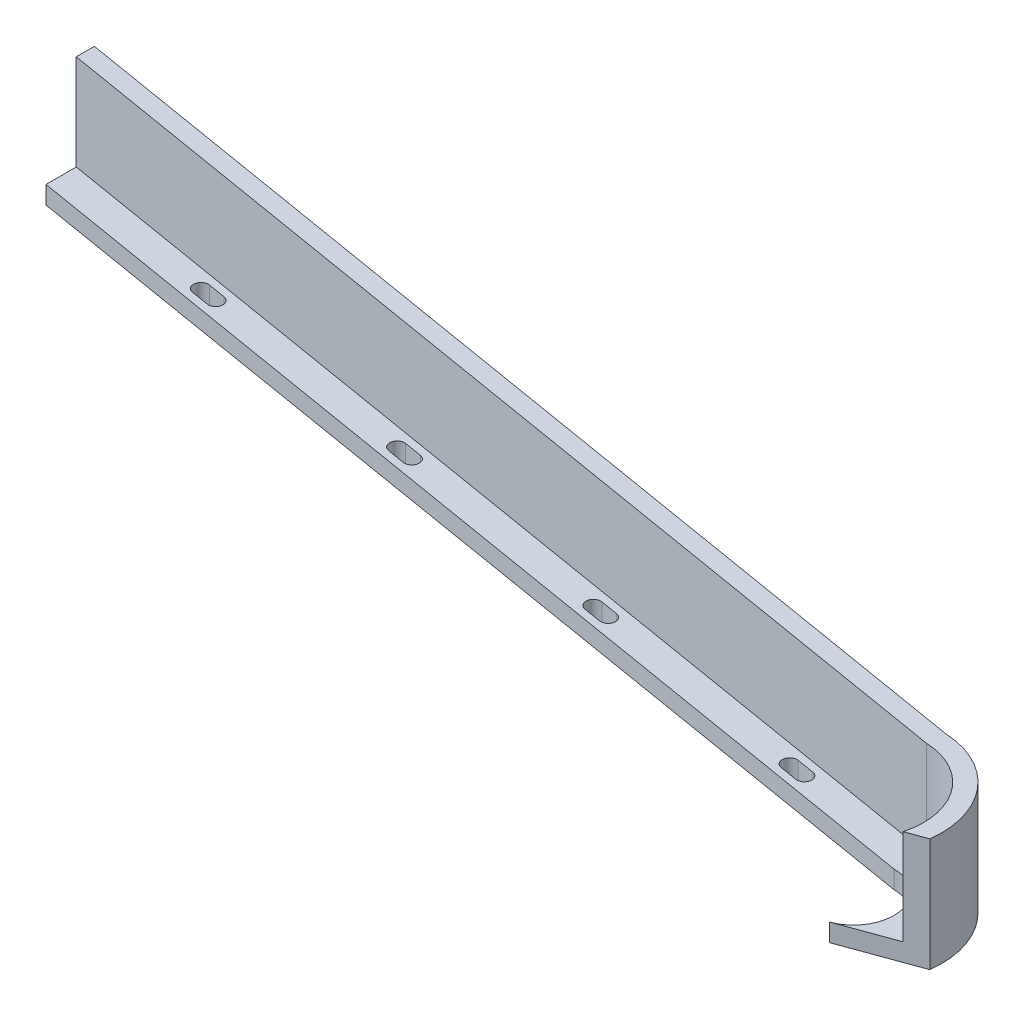
ISO-10303-21;
HEADER;
FILE_DESCRIPTION(('STEP AP214'),'2;1');
FILE_NAME('part.step','',(''),(''),'','','');
FILE_SCHEMA(('AUTOMOTIVE_DESIGN { 1 0 10303 214 1 1 1 1 }'));
ENDSEC;
DATA;
#1=APPLICATION_CONTEXT('core data for automotive mechanical design processes');
#2=APPLICATION_PROTOCOL_DEFINITION('international standard','automotive_design',2000,#1);
#3=PRODUCT_CONTEXT('',#1,'mechanical');
#4=PRODUCT('Part','Part','',(#3));
#5=PRODUCT_RELATED_PRODUCT_CATEGORY('part','',(#4));
#6=PRODUCT_DEFINITION_FORMATION('','',#4);
#7=PRODUCT_DEFINITION_CONTEXT('part definition',#1,'design');
#8=PRODUCT_DEFINITION('design','',#6,#7);
#9=PRODUCT_DEFINITION_SHAPE('','',#8);
#10=(LENGTH_UNIT() NAMED_UNIT(*) SI_UNIT(.MILLI.,.METRE.));
#11=(NAMED_UNIT(*) PLANE_ANGLE_UNIT() SI_UNIT($,.RADIAN.));
#12=(NAMED_UNIT(*) SI_UNIT($,.STERADIAN.) SOLID_ANGLE_UNIT());
#13=UNCERTAINTY_MEASURE_WITH_UNIT(LENGTH_MEASURE(1.E-05),#10,'distance_accuracy_value','');
#14=(GEOMETRIC_REPRESENTATION_CONTEXT(3) GLOBAL_UNCERTAINTY_ASSIGNED_CONTEXT((#13)) GLOBAL_UNIT_ASSIGNED_CONTEXT((#10,
#11,#12)) REPRESENTATION_CONTEXT('',''));
#15=CARTESIAN_POINT('',(0.,0.,0.));
#16=DIRECTION('',(0.,0.,1.));
#17=DIRECTION('',(1.,0.,0.));
#18=AXIS2_PLACEMENT_3D('',#15,#16,#17);
#19=CARTESIAN_POINT('',(121.75,4.,-9.));
#20=DIRECTION('',(0.,1.,0.));
#21=DIRECTION('',(0.,0.,1.));
#22=AXIS2_PLACEMENT_3D('',#19,#20,#21);
#23=PLANE('',#22);
#24=DIRECTION('',(0.986481724359257,0.,0.1638713138569));
#25=VECTOR('',#24,1.);
#26=CARTESIAN_POINT('',(9.56956828655996,4.,-54.0890718197228));
#27=LINE('',#26,#25);
#28=CARTESIAN_POINT('',(9.56956828655996,4.,-54.0890718197228));
#29=VERTEX_POINT('',#28);
#30=CARTESIAN_POINT('',(12.5290134596377,4.,-53.5974578781521));
#31=VERTEX_POINT('',#30);
#32=EDGE_CURVE('E476',#29,#31,#27,.T.);
#33=ORIENTED_EDGE('',*,*,#32,.F.);
#34=CARTESIAN_POINT('',(9.36472914423883,4.,-52.8559696642737));
#35=DIRECTION('',(0.,-1.,0.));
#36=DIRECTION('',(0.,0.,-1.));
#37=AXIS2_PLACEMENT_3D('',#34,#35,#36);
#38=CIRCLE('',#37,1.25000000000001);
#39=CARTESIAN_POINT('',(9.15989000191771,4.,-51.6228675088246));
#40=VERTEX_POINT('',#39);
#41=EDGE_CURVE('E66',#40,#29,#38,.T.);
#42=ORIENTED_EDGE('',*,*,#41,.F.);
#43=DIRECTION('',(0.986481724359257,0.,0.163871313856899));
#44=VECTOR('',#43,1.);
#45=CARTESIAN_POINT('',(9.15989000191771,4.,-51.6228675088246));
#46=LINE('',#45,#44);
#47=CARTESIAN_POINT('',(12.1193351749955,4.,-51.1312535672539));
#48=VERTEX_POINT('',#47);
#49=EDGE_CURVE('E350',#40,#48,#46,.T.);
#50=ORIENTED_EDGE('',*,*,#49,.T.);
#51=CARTESIAN_POINT('',(12.3241743173166,4.,-52.364355722703));
#52=DIRECTION('',(0.,-1.,0.));
#53=DIRECTION('',(0.,0.,-1.));
#54=AXIS2_PLACEMENT_3D('',#51,#52,#53);
#55=CIRCLE('',#54,1.25000000000001);
#56=EDGE_CURVE('E336',#31,#48,#55,.T.);
#57=ORIENTED_EDGE('',*,*,#56,.F.);
#58=EDGE_LOOP('',(#33,#42,#50,#57));
#59=FACE_BOUND('',#58,.T.);
#60=DIRECTION('',(0.986481724359257,0.,0.163871313856899));
#61=VECTOR('',#60,1.);
#62=CARTESIAN_POINT('',(49.0288372609302,4.,-47.5342192654469));
#63=LINE('',#62,#61);
#64=CARTESIAN_POINT('',(49.0288372609302,4.,-47.5342192654468));
#65=VERTEX_POINT('',#64);
#66=CARTESIAN_POINT('',(51.988282434008,4.,-47.0426053238762));
#67=VERTEX_POINT('',#66);
#68=EDGE_CURVE('E373',#65,#67,#63,.T.);
#69=ORIENTED_EDGE('',*,*,#68,.F.);
#70=CARTESIAN_POINT('',(48.8239981186091,4.,-46.3011171099977));
#71=DIRECTION('',(0.,-1.,0.));
#72=DIRECTION('',(0.,0.,-1.));
#73=AXIS2_PLACEMENT_3D('',#70,#71,#72);
#74=CIRCLE('',#73,1.25000000000002);
#75=CARTESIAN_POINT('',(48.619158976288,4.,-45.0680149545487));
#76=VERTEX_POINT('',#75);
#77=EDGE_CURVE('E377',#76,#65,#74,.T.);
#78=ORIENTED_EDGE('',*,*,#77,.F.);
#79=DIRECTION('',(0.986481724359257,0.,0.1638713138569));
#80=VECTOR('',#79,1.);
#81=CARTESIAN_POINT('',(48.619158976288,4.,-45.0680149545487));
#82=LINE('',#81,#80);
#83=CARTESIAN_POINT('',(51.5786041493658,4.,-44.576401012978));
#84=VERTEX_POINT('',#83);
#85=EDGE_CURVE('E355',#76,#84,#82,.T.);
#86=ORIENTED_EDGE('',*,*,#85,.T.);
#87=CARTESIAN_POINT('',(51.7834432916869,4.,-45.809503168427));
#88=DIRECTION('',(0.,-1.,0.));
#89=DIRECTION('',(0.,0.,-1.));
#90=AXIS2_PLACEMENT_3D('',#87,#88,#89);
#91=CIRCLE('',#90,1.25000000000002);
#92=EDGE_CURVE('E369',#67,#84,#91,.T.);
#93=ORIENTED_EDGE('',*,*,#92,.F.);
#94=EDGE_LOOP('',(#69,#78,#86,#93));
#95=FACE_BOUND('',#94,.T.);
#96=DIRECTION('',(0.986481724359258,0.,0.163871313856898));
#97=VECTOR('',#96,1.);
#98=CARTESIAN_POINT('',(88.4881062353005,4.,-40.9793667111709));
#99=LINE('',#98,#97);
#100=CARTESIAN_POINT('',(88.4881062353005,4.,-40.9793667111709));
#101=VERTEX_POINT('',#100);
#102=CARTESIAN_POINT('',(91.4475514083783,4.,-40.4877527696002));
#103=VERTEX_POINT('',#102);
#104=EDGE_CURVE('E402',#101,#103,#99,.T.);
#105=ORIENTED_EDGE('',*,*,#104,.F.);
#106=CARTESIAN_POINT('',(88.2832670929794,4.,-39.7462645557218));
#107=DIRECTION('',(0.,-1.,0.));
#108=DIRECTION('',(0.,0.,-1.));
#109=AXIS2_PLACEMENT_3D('',#106,#107,#108);
#110=CIRCLE('',#109,1.25000000000002);
#111=CARTESIAN_POINT('',(88.0784279506583,4.,-38.5131624002727));
#112=VERTEX_POINT('',#111);
#113=EDGE_CURVE('E365',#112,#101,#110,.T.);
#114=ORIENTED_EDGE('',*,*,#113,.F.);
#115=DIRECTION('',(0.986481724359258,0.,0.163871313856898));
#116=VECTOR('',#115,1.);
#117=CARTESIAN_POINT('',(88.0784279506583,4.,-38.5131624002727));
#118=LINE('',#117,#116);
#119=CARTESIAN_POINT('',(91.037873123736,4.,-38.021548458702));
#120=VERTEX_POINT('',#119);
#121=EDGE_CURVE('E384',#112,#120,#118,.T.);
#122=ORIENTED_EDGE('',*,*,#121,.T.);
#123=CARTESIAN_POINT('',(91.2427122660572,4.,-39.2546506141511));
#124=DIRECTION('',(0.,-1.,0.));
#125=DIRECTION('',(0.,0.,-1.));
#126=AXIS2_PLACEMENT_3D('',#123,#124,#125);
#127=CIRCLE('',#126,1.25000000000002);
#128=EDGE_CURVE('E398',#103,#120,#127,.T.);
#129=ORIENTED_EDGE('',*,*,#128,.F.);
#130=EDGE_LOOP('',(#105,#114,#122,#129));
#131=FACE_BOUND('',#130,.T.);
#132=DIRECTION('',(0.986481724359257,0.,0.1638713138569));
#133=VECTOR('',#132,1.);
#134=CARTESIAN_POINT('',(127.947375209671,4.,-34.4245141568949));
#135=LINE('',#134,#133);
#136=CARTESIAN_POINT('',(127.947375209671,4.,-34.4245141568949));
#137=VERTEX_POINT('',#136);
#138=CARTESIAN_POINT('',(130.906820382749,4.,-33.9329002153242));
#139=VERTEX_POINT('',#138);
#140=EDGE_CURVE('E430',#137,#139,#135,.T.);
#141=ORIENTED_EDGE('',*,*,#140,.F.);
#142=CARTESIAN_POINT('',(127.74253606735,4.,-33.1914120014458));
#143=DIRECTION('',(0.,-1.,0.));
#144=DIRECTION('',(0.,0.,-1.));
#145=AXIS2_PLACEMENT_3D('',#142,#143,#144);
#146=CIRCLE('',#145,1.25000000000002);
#147=CARTESIAN_POINT('',(127.537696925029,4.,-31.9583098459967));
#148=VERTEX_POINT('',#147);
#149=EDGE_CURVE('E394',#148,#137,#146,.T.);
#150=ORIENTED_EDGE('',*,*,#149,.F.);
#151=DIRECTION('',(0.986481724359257,0.,0.1638713138569));
#152=VECTOR('',#151,1.);
#153=CARTESIAN_POINT('',(127.537696925029,4.,-31.9583098459967));
#154=LINE('',#153,#152);
#155=CARTESIAN_POINT('',(130.497142098106,4.,-31.466695904426));
#156=VERTEX_POINT('',#155);
#157=EDGE_CURVE('E412',#148,#156,#154,.T.);
#158=ORIENTED_EDGE('',*,*,#157,.T.);
#159=CARTESIAN_POINT('',(130.701981240427,4.,-32.6997980598751));
#160=DIRECTION('',(0.,-1.,0.));
#161=DIRECTION('',(0.,0.,-1.));
#162=AXIS2_PLACEMENT_3D('',#159,#160,#161);
#163=CIRCLE('',#162,1.25000000000002);
#164=EDGE_CURVE('E426',#139,#156,#163,.T.);
#165=ORIENTED_EDGE('',*,*,#164,.F.);
#166=EDGE_LOOP('',(#141,#150,#158,#165));
#167=FACE_BOUND('',#166,.T.);
#168=CARTESIAN_POINT('',(151.75,4.,-19.9191070279861));
#169=DIRECTION('',(0.,-1.,0.));
#170=DIRECTION('',(0.,0.,-1.));
#171=AXIS2_PLACEMENT_3D('',#168,#169,#170);
#172=CIRCLE('',#171,6.75);
#173=CARTESIAN_POINT('',(151.75,4.,-26.6691070279861));
#174=VERTEX_POINT('',#173);
#175=CARTESIAN_POINT('',(154.058635967448,4.,-13.5761818376812));
#176=VERTEX_POINT('',#175);
#177=EDGE_CURVE('E438',#174,#176,#172,.T.);
#178=ORIENTED_EDGE('',*,*,#177,.F.);
#179=DIRECTION('',(0.986481724359257,0.,0.163871313856899));
#180=VECTOR('',#179,1.);
#181=CARTESIAN_POINT('',(8.38628795520735,4.,-50.4842464999735));
#182=LINE('',#181,#180);
#183=CARTESIAN_POINT('',(-18.75,4.,-54.9920433000686));
#184=VERTEX_POINT('',#183);
#185=EDGE_CURVE('E218',#184,#174,#182,.T.);
#186=ORIENTED_EDGE('',*,*,#185,.F.);
#187=DIRECTION('',(0.,0.,-1.));
#188=VECTOR('',#187,1.);
#189=CARTESIAN_POINT('',(-18.75,4.,-9.00000000000003));
#190=LINE('',#189,#188);
#191=CARTESIAN_POINT('',(-18.75,4.,-63.1016714892742));
#192=VERTEX_POINT('',#191);
#193=EDGE_CURVE('E211',#184,#192,#190,.T.);
#194=ORIENTED_EDGE('',*,*,#193,.T.);
#195=DIRECTION('',(0.986481724359257,0.,0.163871313856899));
#196=VECTOR('',#195,1.);
#197=CARTESIAN_POINT('',(-18.75,4.,-63.1016714892742));
#198=LINE('',#197,#196);
#199=CARTESIAN_POINT('',(152.536154407006,4.,-34.6481416619444));
#200=VERTEX_POINT('',#199);
#201=EDGE_CURVE('E215',#192,#200,#198,.T.);
#202=ORIENTED_EDGE('',*,*,#201,.T.);
#203=CARTESIAN_POINT('',(151.75,4.,-19.9191070279861));
#204=DIRECTION('',(0.,1.,0.));
#205=DIRECTION('',(0.,0.,1.));
#206=AXIS2_PLACEMENT_3D('',#203,#204,#205);
#207=CIRCLE('',#206,14.75);
#208=CARTESIAN_POINT('',(166.382589152536,4.,-18.0617339655433));
#209=VERTEX_POINT('',#208);
#210=EDGE_CURVE('E233',#200,#209,#207,.F.);
#211=ORIENTED_EDGE('',*,*,#210,.T.);
#212=DIRECTION('',(0.939692620785908,0.,-0.342020143325669));
#213=VECTOR('',#212,1.);
#214=CARTESIAN_POINT('',(124.058635967448,4.,-2.65707480969512));
#215=LINE('',#214,#213);
#216=EDGE_CURVE('E249',#176,#209,#215,.T.);
#217=ORIENTED_EDGE('',*,*,#216,.F.);
#218=EDGE_LOOP('',(#178,#186,#194,#202,#211,#217));
#219=FACE_BOUND('',#218,.T.);
#220=ADVANCED_FACE('F42',(#59,#95,#131,#167,#219),#23,.F.);
#221=CARTESIAN_POINT('',(121.75,7.,-9.));
#222=DIRECTION('',(0.,1.,0.));
#223=DIRECTION('',(0.,0.,1.));
#224=AXIS2_PLACEMENT_3D('',#221,#222,#223);
#225=PLANE('',#224);
#226=DIRECTION('',(0.986481724359257,0.,0.163871313856899));
#227=VECTOR('',#226,1.);
#228=CARTESIAN_POINT('',(126.231288954336,7.,-35.9767145388615));
#229=LINE('',#228,#227);
#230=CARTESIAN_POINT('',(-18.75,7.,-60.0605609183221));
#231=VERTEX_POINT('',#230);
#232=CARTESIAN_POINT('',(152.218782472689,7.,-31.6597519418441));
#233=VERTEX_POINT('',#232);
#234=EDGE_CURVE('E58',#231,#233,#229,.T.);
#235=ORIENTED_EDGE('',*,*,#234,.F.);
#236=DIRECTION('',(0.,0.,1.));
#237=VECTOR('',#236,1.);
#238=CARTESIAN_POINT('',(-18.75,7.,0.));
#239=LINE('',#238,#237);
#240=CARTESIAN_POINT('',(-18.75,7.,-54.9920433000686));
#241=VERTEX_POINT('',#240);
#242=EDGE_CURVE('E223',#231,#241,#239,.T.);
#243=ORIENTED_EDGE('',*,*,#242,.T.);
#244=DIRECTION('',(-0.986481724359257,0.,-0.163871313856899));
#245=VECTOR('',#244,1.);
#246=CARTESIAN_POINT('',(125.411932385052,7.,-31.0443059170652));
#247=LINE('',#246,#245);
#248=CARTESIAN_POINT('',(151.75,7.,-26.6691070279861));
#249=VERTEX_POINT('',#248);
#250=EDGE_CURVE('E243',#249,#241,#247,.T.);
#251=ORIENTED_EDGE('',*,*,#250,.F.);
#252=CARTESIAN_POINT('',(151.75,7.,-19.9191070279861));
#253=DIRECTION('',(0.,1.,0.));
#254=DIRECTION('',(0.,0.,1.));
#255=AXIS2_PLACEMENT_3D('',#252,#253,#254);
#256=CIRCLE('',#255,6.75);
#257=CARTESIAN_POINT('',(154.058635967448,7.,-13.5761818376812));
#258=VERTEX_POINT('',#257);
#259=EDGE_CURVE('E240',#258,#249,#256,.T.);
#260=ORIENTED_EDGE('',*,*,#259,.F.);
#261=DIRECTION('',(0.939692620785908,0.,-0.342020143325669));
#262=VECTOR('',#261,1.);
#263=CARTESIAN_POINT('',(124.058635967448,7.,-2.65707480969512));
#264=LINE('',#263,#262);
#265=CARTESIAN_POINT('',(163.096310197816,7.,-16.8656262445298));
#266=VERTEX_POINT('',#265);
#267=EDGE_CURVE('E250',#258,#266,#264,.T.);
#268=ORIENTED_EDGE('',*,*,#267,.T.);
#269=CARTESIAN_POINT('',(151.75,7.,-19.9191070279861));
#270=DIRECTION('',(0.,1.,0.));
#271=DIRECTION('',(0.,0.,1.));
#272=AXIS2_PLACEMENT_3D('',#269,#270,#271);
#273=CIRCLE('',#272,11.75);
#274=EDGE_CURVE('E456',#266,#233,#273,.T.);
#275=ORIENTED_EDGE('',*,*,#274,.T.);
#276=EDGE_LOOP('',(#235,#243,#251,#260,#268,#275));
#277=FACE_BOUND('',#276,.T.);
#278=CARTESIAN_POINT('',(9.36472914423883,7.,-52.8559696642737));
#279=DIRECTION('',(0.,1.,0.));
#280=DIRECTION('',(0.,0.,1.));
#281=AXIS2_PLACEMENT_3D('',#278,#279,#280);
#282=CIRCLE('',#281,1.25000000000001);
#283=CARTESIAN_POINT('',(9.56956828655996,7.,-54.0890718197228));
#284=VERTEX_POINT('',#283);
#285=CARTESIAN_POINT('',(9.15989000191771,7.,-51.6228675088246));
#286=VERTEX_POINT('',#285);
#287=EDGE_CURVE('E12',#284,#286,#282,.T.);
#288=ORIENTED_EDGE('',*,*,#287,.F.);
#289=DIRECTION('',(-0.986481724359257,0.,-0.1638713138569));
#290=VECTOR('',#289,1.);
#291=CARTESIAN_POINT('',(126.026449812015,7.,-34.7436123834123));
#292=LINE('',#291,#290);
#293=CARTESIAN_POINT('',(12.5290134596377,7.,-53.5974578781521));
#294=VERTEX_POINT('',#293);
#295=EDGE_CURVE('E311',#294,#284,#292,.T.);
#296=ORIENTED_EDGE('',*,*,#295,.F.);
#297=CARTESIAN_POINT('',(12.3241743173166,7.,-52.364355722703));
#298=DIRECTION('',(0.,1.,0.));
#299=DIRECTION('',(0.,0.,1.));
#300=AXIS2_PLACEMENT_3D('',#297,#298,#299);
#301=CIRCLE('',#300,1.25000000000001);
#302=CARTESIAN_POINT('',(12.1193351749955,7.,-51.1312535672539));
#303=VERTEX_POINT('',#302);
#304=EDGE_CURVE('E314',#303,#294,#301,.T.);
#305=ORIENTED_EDGE('',*,*,#304,.F.);
#306=DIRECTION('',(-0.986481724359257,0.,-0.163871313856899));
#307=VECTOR('',#306,1.);
#308=CARTESIAN_POINT('',(125.616771527373,7.,-32.2774080725142));
#309=LINE('',#308,#307);
#310=EDGE_CURVE('E51',#303,#286,#309,.T.);
#311=ORIENTED_EDGE('',*,*,#310,.T.);
#312=EDGE_LOOP('',(#288,#296,#305,#311));
#313=FACE_BOUND('',#312,.T.);
#314=CARTESIAN_POINT('',(48.8239981186091,7.,-46.3011171099977));
#315=DIRECTION('',(0.,1.,0.));
#316=DIRECTION('',(0.,0.,1.));
#317=AXIS2_PLACEMENT_3D('',#314,#315,#316);
#318=CIRCLE('',#317,1.25000000000002);
#319=CARTESIAN_POINT('',(49.0288372609302,7.,-47.5342192654469));
#320=VERTEX_POINT('',#319);
#321=CARTESIAN_POINT('',(48.619158976288,7.,-45.0680149545487));
#322=VERTEX_POINT('',#321);
#323=EDGE_CURVE('E308',#320,#322,#318,.T.);
#324=ORIENTED_EDGE('',*,*,#323,.F.);
#325=DIRECTION('',(-0.986481724359257,0.,-0.163871313856899));
#326=VECTOR('',#325,1.);
#327=CARTESIAN_POINT('',(126.026449812015,7.,-34.7436123834123));
#328=LINE('',#327,#326);
#329=CARTESIAN_POINT('',(51.988282434008,7.,-47.0426053238761));
#330=VERTEX_POINT('',#329);
#331=EDGE_CURVE('E297',#330,#320,#328,.T.);
#332=ORIENTED_EDGE('',*,*,#331,.F.);
#333=CARTESIAN_POINT('',(51.7834432916869,7.,-45.809503168427));
#334=DIRECTION('',(0.,1.,0.));
#335=DIRECTION('',(0.,0.,1.));
#336=AXIS2_PLACEMENT_3D('',#333,#334,#335);
#337=CIRCLE('',#336,1.25000000000002);
#338=CARTESIAN_POINT('',(51.5786041493658,7.,-44.576401012978));
#339=VERTEX_POINT('',#338);
#340=EDGE_CURVE('E300',#339,#330,#337,.T.);
#341=ORIENTED_EDGE('',*,*,#340,.F.);
#342=DIRECTION('',(-0.986481724359257,0.,-0.1638713138569));
#343=VECTOR('',#342,1.);
#344=CARTESIAN_POINT('',(125.616771527373,7.,-32.2774080725141));
#345=LINE('',#344,#343);
#346=EDGE_CURVE('E304',#339,#322,#345,.T.);
#347=ORIENTED_EDGE('',*,*,#346,.T.);
#348=EDGE_LOOP('',(#324,#332,#341,#347));
#349=FACE_BOUND('',#348,.T.);
#350=CARTESIAN_POINT('',(88.2832670929794,7.,-39.7462645557218));
#351=DIRECTION('',(0.,1.,0.));
#352=DIRECTION('',(0.,0.,1.));
#353=AXIS2_PLACEMENT_3D('',#350,#351,#352);
#354=CIRCLE('',#353,1.25000000000002);
#355=CARTESIAN_POINT('',(88.4881062353005,7.,-40.9793667111709));
#356=VERTEX_POINT('',#355);
#357=CARTESIAN_POINT('',(88.0784279506583,7.,-38.5131624002727));
#358=VERTEX_POINT('',#357);
#359=EDGE_CURVE('E294',#356,#358,#354,.T.);
#360=ORIENTED_EDGE('',*,*,#359,.F.);
#361=DIRECTION('',(-0.986481724359257,0.,-0.163871313856898));
#362=VECTOR('',#361,1.);
#363=CARTESIAN_POINT('',(126.026449812015,7.,-34.7436123834124));
#364=LINE('',#363,#362);
#365=CARTESIAN_POINT('',(91.4475514083783,7.,-40.4877527696002));
#366=VERTEX_POINT('',#365);
#367=EDGE_CURVE('E283',#366,#356,#364,.T.);
#368=ORIENTED_EDGE('',*,*,#367,.F.);
#369=CARTESIAN_POINT('',(91.2427122660572,7.,-39.2546506141511));
#370=DIRECTION('',(0.,1.,0.));
#371=DIRECTION('',(0.,0.,1.));
#372=AXIS2_PLACEMENT_3D('',#369,#370,#371);
#373=CIRCLE('',#372,1.25000000000002);
#374=CARTESIAN_POINT('',(91.037873123736,7.,-38.021548458702));
#375=VERTEX_POINT('',#374);
#376=EDGE_CURVE('E286',#375,#366,#373,.T.);
#377=ORIENTED_EDGE('',*,*,#376,.F.);
#378=DIRECTION('',(-0.986481724359257,0.,-0.163871313856898));
#379=VECTOR('',#378,1.);
#380=CARTESIAN_POINT('',(125.616771527373,7.,-32.2774080725142));
#381=LINE('',#380,#379);
#382=EDGE_CURVE('E290',#375,#358,#381,.T.);
#383=ORIENTED_EDGE('',*,*,#382,.T.);
#384=EDGE_LOOP('',(#360,#368,#377,#383));
#385=FACE_BOUND('',#384,.T.);
#386=CARTESIAN_POINT('',(127.74253606735,7.,-33.1914120014458));
#387=DIRECTION('',(0.,1.,0.));
#388=DIRECTION('',(0.,0.,1.));
#389=AXIS2_PLACEMENT_3D('',#386,#387,#388);
#390=CIRCLE('',#389,1.25000000000002);
#391=CARTESIAN_POINT('',(127.947375209671,7.,-34.4245141568949));
#392=VERTEX_POINT('',#391);
#393=CARTESIAN_POINT('',(127.537696925029,7.,-31.9583098459967));
#394=VERTEX_POINT('',#393);
#395=EDGE_CURVE('E280',#392,#394,#390,.T.);
#396=ORIENTED_EDGE('',*,*,#395,.F.);
#397=DIRECTION('',(-0.986481724359257,0.,-0.1638713138569));
#398=VECTOR('',#397,1.);
#399=CARTESIAN_POINT('',(126.026449812015,7.,-34.7436123834124));
#400=LINE('',#399,#398);
#401=CARTESIAN_POINT('',(130.906820382749,7.,-33.9329002153242));
#402=VERTEX_POINT('',#401);
#403=EDGE_CURVE('E269',#402,#392,#400,.T.);
#404=ORIENTED_EDGE('',*,*,#403,.F.);
#405=CARTESIAN_POINT('',(130.701981240427,7.,-32.6997980598751));
#406=DIRECTION('',(0.,1.,0.));
#407=DIRECTION('',(0.,0.,1.));
#408=AXIS2_PLACEMENT_3D('',#405,#406,#407);
#409=CIRCLE('',#408,1.25000000000002);
#410=CARTESIAN_POINT('',(130.497142098106,7.,-31.466695904426));
#411=VERTEX_POINT('',#410);
#412=EDGE_CURVE('E272',#411,#402,#409,.T.);
#413=ORIENTED_EDGE('',*,*,#412,.F.);
#414=DIRECTION('',(-0.986481724359257,0.,-0.1638713138569));
#415=VECTOR('',#414,1.);
#416=CARTESIAN_POINT('',(125.616771527373,7.,-32.2774080725142));
#417=LINE('',#416,#415);
#418=EDGE_CURVE('E276',#411,#394,#417,.T.);
#419=ORIENTED_EDGE('',*,*,#418,.T.);
#420=EDGE_LOOP('',(#396,#404,#413,#419));
#421=FACE_BOUND('',#420,.T.);
#422=ADVANCED_FACE('F322',(#277,#313,#349,#385,#421),#225,.T.);
#423=CARTESIAN_POINT('',(13.6581362489911,4.,37.5254209359376));
#424=DIRECTION('',(-0.342020143325669,0.,-0.939692620785908));
#425=DIRECTION('',(-0.939692620785908,0.,0.342020143325669));
#426=AXIS2_PLACEMENT_3D('',#423,#424,#425);
#427=PLANE('',#426);
#428=ORIENTED_EDGE('',*,*,#216,.T.);
#429=DIRECTION('',(0.,-1.,0.));
#430=VECTOR('',#429,1.);
#431=CARTESIAN_POINT('',(166.382589152536,7.,-18.0617339655433));
#432=LINE('',#431,#430);
#433=CARTESIAN_POINT('',(166.382589152536,23.,-18.0617339655433));
#434=VERTEX_POINT('',#433);
#435=EDGE_CURVE('E258',#434,#209,#432,.T.);
#436=ORIENTED_EDGE('',*,*,#435,.F.);
#437=DIRECTION('',(0.939692620785908,0.,-0.342020143325669));
#438=VECTOR('',#437,1.);
#439=CARTESIAN_POINT('',(124.058635967448,23.,-2.65707480969513));
#440=LINE('',#439,#438);
#441=CARTESIAN_POINT('',(163.096310197816,23.,-16.8656262445298));
#442=VERTEX_POINT('',#441);
#443=EDGE_CURVE('E523',#442,#434,#440,.T.);
#444=ORIENTED_EDGE('',*,*,#443,.F.);
#445=DIRECTION('',(0.,-1.,0.));
#446=VECTOR('',#445,1.);
#447=CARTESIAN_POINT('',(163.096310197816,23.,-16.8656262445298));
#448=LINE('',#447,#446);
#449=EDGE_CURVE('E469',#442,#266,#448,.T.);
#450=ORIENTED_EDGE('',*,*,#449,.T.);
#451=ORIENTED_EDGE('',*,*,#267,.F.);
#452=DIRECTION('',(0.,-1.,0.));
#453=VECTOR('',#452,1.);
#454=CARTESIAN_POINT('',(154.058635967448,14.,-13.5761818376812));
#455=LINE('',#454,#453);
#456=EDGE_CURVE('E265',#258,#176,#455,.T.);
#457=ORIENTED_EDGE('',*,*,#456,.T.);
#458=EDGE_LOOP('',(#428,#436,#444,#450,#451,#457));
#459=FACE_BOUND('',#458,.T.);
#460=ADVANCED_FACE('F44',(#459),#427,.F.);
#461=CARTESIAN_POINT('',(151.75,7.,-19.9191070279861));
#462=DIRECTION('',(0.,-1.,0.));
#463=DIRECTION('',(0.,0.,-1.));
#464=AXIS2_PLACEMENT_3D('',#461,#462,#463);
#465=CYLINDRICAL_SURFACE('',#464,14.75);
#466=ORIENTED_EDGE('',*,*,#435,.T.);
#467=ORIENTED_EDGE('',*,*,#210,.F.);
#468=DIRECTION('',(0.,-1.,0.));
#469=VECTOR('',#468,1.);
#470=CARTESIAN_POINT('',(152.536154407006,7.,-34.6481416619444));
#471=LINE('',#470,#469);
#472=CARTESIAN_POINT('',(152.536154407006,23.,-34.6481416619444));
#473=VERTEX_POINT('',#472);
#474=EDGE_CURVE('E231',#473,#200,#471,.T.);
#475=ORIENTED_EDGE('',*,*,#474,.F.);
#476=CARTESIAN_POINT('',(151.75,23.,-19.9191070279861));
#477=DIRECTION('',(0.,1.,0.));
#478=DIRECTION('',(0.,0.,1.));
#479=AXIS2_PLACEMENT_3D('',#476,#477,#478);
#480=CIRCLE('',#479,14.75);
#481=EDGE_CURVE('E520',#434,#473,#480,.T.);
#482=ORIENTED_EDGE('',*,*,#481,.F.);
#483=EDGE_LOOP('',(#466,#467,#475,#482));
#484=FACE_BOUND('',#483,.T.);
#485=ADVANCED_FACE('F512',(#484),#465,.T.);
#486=CARTESIAN_POINT('',(152.536154407006,7.,-34.6481416619445));
#487=DIRECTION('',(-0.163871313856899,0.,0.986481724359257));
#488=DIRECTION('',(0.986481724359257,0.,0.163871313856899));
#489=AXIS2_PLACEMENT_3D('',#486,#487,#488);
#490=PLANE('',#489);
#491=ORIENTED_EDGE('',*,*,#474,.T.);
#492=ORIENTED_EDGE('',*,*,#201,.F.);
#493=DIRECTION('',(0.,1.,0.));
#494=VECTOR('',#493,1.);
#495=CARTESIAN_POINT('',(-18.75,-12.,-63.1016714892742));
#496=LINE('',#495,#494);
#497=CARTESIAN_POINT('',(-18.75,23.,-63.1016714892742));
#498=VERTEX_POINT('',#497);
#499=EDGE_CURVE('E224',#192,#498,#496,.T.);
#500=ORIENTED_EDGE('',*,*,#499,.T.);
#501=DIRECTION('',(-0.986481724359257,0.,-0.163871313856899));
#502=VECTOR('',#501,1.);
#503=CARTESIAN_POINT('',(126.722902895907,23.,-38.9361597119392));
#504=LINE('',#503,#502);
#505=EDGE_CURVE('E534',#473,#498,#504,.T.);
#506=ORIENTED_EDGE('',*,*,#505,.F.);
#507=EDGE_LOOP('',(#491,#492,#500,#506));
#508=FACE_BOUND('',#507,.T.);
#509=ADVANCED_FACE('F228',(#508),#490,.F.);
#510=CARTESIAN_POINT('',(-18.75,-12.,-2.25));
#511=DIRECTION('',(1.,0.,0.));
#512=DIRECTION('',(0.,0.,-1.));
#513=AXIS2_PLACEMENT_3D('',#510,#511,#512);
#514=PLANE('',#513);
#515=ORIENTED_EDGE('',*,*,#499,.F.);
#516=ORIENTED_EDGE('',*,*,#193,.F.);
#517=DIRECTION('',(0.,1.,0.));
#518=VECTOR('',#517,1.);
#519=CARTESIAN_POINT('',(-18.75,-12.,-54.9920433000686));
#520=LINE('',#519,#518);
#521=EDGE_CURVE('E262',#184,#241,#520,.T.);
#522=ORIENTED_EDGE('',*,*,#521,.T.);
#523=ORIENTED_EDGE('',*,*,#242,.F.);
#524=DIRECTION('',(0.,-1.,0.));
#525=VECTOR('',#524,1.);
#526=CARTESIAN_POINT('',(-18.75,23.,-60.0605609183221));
#527=LINE('',#526,#525);
#528=CARTESIAN_POINT('',(-18.75,23.,-60.0605609183221));
#529=VERTEX_POINT('',#528);
#530=EDGE_CURVE('E452',#529,#231,#527,.T.);
#531=ORIENTED_EDGE('',*,*,#530,.F.);
#532=DIRECTION('',(0.,0.,1.));
#533=VECTOR('',#532,1.);
#534=CARTESIAN_POINT('',(-18.7499999999999,23.,-8.99999999999984));
#535=LINE('',#534,#533);
#536=EDGE_CURVE('E238',#498,#529,#535,.T.);
#537=ORIENTED_EDGE('',*,*,#536,.F.);
#538=EDGE_LOOP('',(#515,#516,#522,#523,#531,#537));
#539=FACE_BOUND('',#538,.T.);
#540=ADVANCED_FACE('F236',(#539),#514,.F.);
#541=CARTESIAN_POINT('',(8.38628795520735,14.,-50.4842464999735));
#542=DIRECTION('',(0.163871313856899,0.,-0.986481724359257));
#543=DIRECTION('',(-0.986481724359257,0.,-0.163871313856899));
#544=AXIS2_PLACEMENT_3D('',#541,#542,#543);
#545=PLANE('',#544);
#546=ORIENTED_EDGE('',*,*,#250,.T.);
#547=ORIENTED_EDGE('',*,*,#521,.F.);
#548=ORIENTED_EDGE('',*,*,#185,.T.);
#549=DIRECTION('',(0.,-1.,0.));
#550=VECTOR('',#549,1.);
#551=CARTESIAN_POINT('',(151.75,14.,-26.6691070279861));
#552=LINE('',#551,#550);
#553=EDGE_CURVE('E441',#249,#174,#552,.T.);
#554=ORIENTED_EDGE('',*,*,#553,.F.);
#555=EDGE_LOOP('',(#546,#547,#548,#554));
#556=FACE_BOUND('',#555,.T.);
#557=ADVANCED_FACE('F448',(#556),#545,.F.);
#558=CARTESIAN_POINT('',(151.75,14.,-19.9191070279861));
#559=DIRECTION('',(0.,-1.,0.));
#560=DIRECTION('',(0.,0.,-1.));
#561=AXIS2_PLACEMENT_3D('',#558,#559,#560);
#562=CYLINDRICAL_SURFACE('',#561,6.75);
#563=ORIENTED_EDGE('',*,*,#259,.T.);
#564=ORIENTED_EDGE('',*,*,#553,.T.);
#565=ORIENTED_EDGE('',*,*,#177,.T.);
#566=ORIENTED_EDGE('',*,*,#456,.F.);
#567=EDGE_LOOP('',(#563,#564,#565,#566));
#568=FACE_BOUND('',#567,.T.);
#569=ADVANCED_FACE('F546',(#568),#562,.F.);
#570=CARTESIAN_POINT('',(127.74253606735,14.,-33.1914120014458));
#571=DIRECTION('',(0.,-1.,0.));
#572=DIRECTION('',(0.,0.,-1.));
#573=AXIS2_PLACEMENT_3D('',#570,#571,#572);
#574=CYLINDRICAL_SURFACE('',#573,1.25000000000002);
#575=ORIENTED_EDGE('',*,*,#395,.T.);
#576=DIRECTION('',(0.,-1.,0.));
#577=VECTOR('',#576,1.);
#578=CARTESIAN_POINT('',(127.537696925029,14.,-31.9583098459967));
#579=LINE('',#578,#577);
#580=EDGE_CURVE('E419',#394,#148,#579,.T.);
#581=ORIENTED_EDGE('',*,*,#580,.T.);
#582=ORIENTED_EDGE('',*,*,#149,.T.);
#583=DIRECTION('',(0.,-1.,0.));
#584=VECTOR('',#583,1.);
#585=CARTESIAN_POINT('',(127.947375209671,14.,-34.4245141568949));
#586=LINE('',#585,#584);
#587=EDGE_CURVE('E408',#392,#137,#586,.T.);
#588=ORIENTED_EDGE('',*,*,#587,.F.);
#589=EDGE_LOOP('',(#575,#581,#582,#588));
#590=FACE_BOUND('',#589,.T.);
#591=ADVANCED_FACE('F548',(#590),#574,.F.);
#592=CARTESIAN_POINT('',(127.537696925029,14.,-31.9583098459967));
#593=DIRECTION('',(0.1638713138569,0.,-0.986481724359257));
#594=DIRECTION('',(-0.986481724359257,0.,-0.1638713138569));
#595=AXIS2_PLACEMENT_3D('',#592,#593,#594);
#596=PLANE('',#595);
#597=DIRECTION('',(0.,-1.,0.));
#598=VECTOR('',#597,1.);
#599=CARTESIAN_POINT('',(130.497142098106,14.,-31.466695904426));
#600=LINE('',#599,#598);
#601=EDGE_CURVE('E416',#411,#156,#600,.T.);
#602=ORIENTED_EDGE('',*,*,#601,.T.);
#603=ORIENTED_EDGE('',*,*,#157,.F.);
#604=ORIENTED_EDGE('',*,*,#580,.F.);
#605=ORIENTED_EDGE('',*,*,#418,.F.);
#606=EDGE_LOOP('',(#602,#603,#604,#605));
#607=FACE_BOUND('',#606,.T.);
#608=ADVANCED_FACE('F554',(#607),#596,.T.);
#609=CARTESIAN_POINT('',(130.701981240427,14.,-32.6997980598751));
#610=DIRECTION('',(0.,-1.,0.));
#611=DIRECTION('',(0.,0.,-1.));
#612=AXIS2_PLACEMENT_3D('',#609,#610,#611);
#613=CYLINDRICAL_SURFACE('',#612,1.25000000000002);
#614=ORIENTED_EDGE('',*,*,#412,.T.);
#615=DIRECTION('',(0.,-1.,0.));
#616=VECTOR('',#615,1.);
#617=CARTESIAN_POINT('',(130.906820382749,14.,-33.9329002153242));
#618=LINE('',#617,#616);
#619=EDGE_CURVE('E413',#402,#139,#618,.T.);
#620=ORIENTED_EDGE('',*,*,#619,.T.);
#621=ORIENTED_EDGE('',*,*,#164,.T.);
#622=ORIENTED_EDGE('',*,*,#601,.F.);
#623=EDGE_LOOP('',(#614,#620,#621,#622));
#624=FACE_BOUND('',#623,.T.);
#625=ADVANCED_FACE('F645',(#624),#613,.F.);
#626=CARTESIAN_POINT('',(127.947375209671,14.,-34.4245141568949));
#627=DIRECTION('',(0.1638713138569,0.,-0.986481724359257));
#628=DIRECTION('',(-0.986481724359257,0.,-0.1638713138569));
#629=AXIS2_PLACEMENT_3D('',#626,#627,#628);
#630=PLANE('',#629);
#631=ORIENTED_EDGE('',*,*,#403,.T.);
#632=ORIENTED_EDGE('',*,*,#587,.T.);
#633=ORIENTED_EDGE('',*,*,#140,.T.);
#634=ORIENTED_EDGE('',*,*,#619,.F.);
#635=EDGE_LOOP('',(#631,#632,#633,#634));
#636=FACE_BOUND('',#635,.T.);
#637=ADVANCED_FACE('F653',(#636),#630,.F.);
#638=CARTESIAN_POINT('',(88.2832670929794,14.,-39.7462645557218));
#639=DIRECTION('',(0.,-1.,0.));
#640=DIRECTION('',(0.,0.,-1.));
#641=AXIS2_PLACEMENT_3D('',#638,#639,#640);
#642=CYLINDRICAL_SURFACE('',#641,1.25000000000002);
#643=ORIENTED_EDGE('',*,*,#359,.T.);
#644=DIRECTION('',(0.,-1.,0.));
#645=VECTOR('',#644,1.);
#646=CARTESIAN_POINT('',(88.0784279506583,14.,-38.5131624002727));
#647=LINE('',#646,#645);
#648=EDGE_CURVE('E391',#358,#112,#647,.T.);
#649=ORIENTED_EDGE('',*,*,#648,.T.);
#650=ORIENTED_EDGE('',*,*,#113,.T.);
#651=DIRECTION('',(0.,-1.,0.));
#652=VECTOR('',#651,1.);
#653=CARTESIAN_POINT('',(88.4881062353005,14.,-40.9793667111709));
#654=LINE('',#653,#652);
#655=EDGE_CURVE('E380',#356,#101,#654,.T.);
#656=ORIENTED_EDGE('',*,*,#655,.F.);
#657=EDGE_LOOP('',(#643,#649,#650,#656));
#658=FACE_BOUND('',#657,.T.);
#659=ADVANCED_FACE('F661',(#658),#642,.F.);
#660=CARTESIAN_POINT('',(88.0784279506583,14.,-38.5131624002727));
#661=DIRECTION('',(0.163871313856898,0.,-0.986481724359257));
#662=DIRECTION('',(-0.986481724359257,0.,-0.163871313856898));
#663=AXIS2_PLACEMENT_3D('',#660,#661,#662);
#664=PLANE('',#663);
#665=DIRECTION('',(0.,-1.,0.));
#666=VECTOR('',#665,1.);
#667=CARTESIAN_POINT('',(91.037873123736,14.,-38.021548458702));
#668=LINE('',#667,#666);
#669=EDGE_CURVE('E388',#375,#120,#668,.T.);
#670=ORIENTED_EDGE('',*,*,#669,.T.);
#671=ORIENTED_EDGE('',*,*,#121,.F.);
#672=ORIENTED_EDGE('',*,*,#648,.F.);
#673=ORIENTED_EDGE('',*,*,#382,.F.);
#674=EDGE_LOOP('',(#670,#671,#672,#673));
#675=FACE_BOUND('',#674,.T.);
#676=ADVANCED_FACE('F670',(#675),#664,.T.);
#677=CARTESIAN_POINT('',(91.2427122660572,14.,-39.2546506141511));
#678=DIRECTION('',(0.,-1.,0.));
#679=DIRECTION('',(0.,0.,-1.));
#680=AXIS2_PLACEMENT_3D('',#677,#678,#679);
#681=CYLINDRICAL_SURFACE('',#680,1.25000000000002);
#682=ORIENTED_EDGE('',*,*,#376,.T.);
#683=DIRECTION('',(0.,-1.,0.));
#684=VECTOR('',#683,1.);
#685=CARTESIAN_POINT('',(91.4475514083783,14.,-40.4877527696002));
#686=LINE('',#685,#684);
#687=EDGE_CURVE('E385',#366,#103,#686,.T.);
#688=ORIENTED_EDGE('',*,*,#687,.T.);
#689=ORIENTED_EDGE('',*,*,#128,.T.);
#690=ORIENTED_EDGE('',*,*,#669,.F.);
#691=EDGE_LOOP('',(#682,#688,#689,#690));
#692=FACE_BOUND('',#691,.T.);
#693=ADVANCED_FACE('F679',(#692),#681,.F.);
#694=CARTESIAN_POINT('',(88.4881062353005,14.,-40.9793667111709));
#695=DIRECTION('',(0.163871313856898,0.,-0.986481724359257));
#696=DIRECTION('',(-0.986481724359257,0.,-0.163871313856898));
#697=AXIS2_PLACEMENT_3D('',#694,#695,#696);
#698=PLANE('',#697);
#699=ORIENTED_EDGE('',*,*,#367,.T.);
#700=ORIENTED_EDGE('',*,*,#655,.T.);
#701=ORIENTED_EDGE('',*,*,#104,.T.);
#702=ORIENTED_EDGE('',*,*,#687,.F.);
#703=EDGE_LOOP('',(#699,#700,#701,#702));
#704=FACE_BOUND('',#703,.T.);
#705=ADVANCED_FACE('F688',(#704),#698,.F.);
#706=CARTESIAN_POINT('',(48.8239981186091,14.,-46.3011171099977));
#707=DIRECTION('',(0.,-1.,0.));
#708=DIRECTION('',(0.,0.,-1.));
#709=AXIS2_PLACEMENT_3D('',#706,#707,#708);
#710=CYLINDRICAL_SURFACE('',#709,1.25000000000002);
#711=ORIENTED_EDGE('',*,*,#323,.T.);
#712=DIRECTION('',(0.,-1.,0.));
#713=VECTOR('',#712,1.);
#714=CARTESIAN_POINT('',(48.619158976288,14.,-45.0680149545487));
#715=LINE('',#714,#713);
#716=EDGE_CURVE('E362',#322,#76,#715,.T.);
#717=ORIENTED_EDGE('',*,*,#716,.T.);
#718=ORIENTED_EDGE('',*,*,#77,.T.);
#719=DIRECTION('',(0.,-1.,0.));
#720=VECTOR('',#719,1.);
#721=CARTESIAN_POINT('',(49.0288372609302,14.,-47.5342192654469));
#722=LINE('',#721,#720);
#723=EDGE_CURVE('E351',#320,#65,#722,.T.);
#724=ORIENTED_EDGE('',*,*,#723,.F.);
#725=EDGE_LOOP('',(#711,#717,#718,#724));
#726=FACE_BOUND('',#725,.T.);
#727=ADVANCED_FACE('F697',(#726),#710,.F.);
#728=CARTESIAN_POINT('',(48.619158976288,14.,-45.0680149545487));
#729=DIRECTION('',(0.1638713138569,0.,-0.986481724359257));
#730=DIRECTION('',(-0.986481724359257,0.,-0.1638713138569));
#731=AXIS2_PLACEMENT_3D('',#728,#729,#730);
#732=PLANE('',#731);
#733=DIRECTION('',(0.,-1.,0.));
#734=VECTOR('',#733,1.);
#735=CARTESIAN_POINT('',(51.5786041493658,14.,-44.576401012978));
#736=LINE('',#735,#734);
#737=EDGE_CURVE('E359',#339,#84,#736,.T.);
#738=ORIENTED_EDGE('',*,*,#737,.T.);
#739=ORIENTED_EDGE('',*,*,#85,.F.);
#740=ORIENTED_EDGE('',*,*,#716,.F.);
#741=ORIENTED_EDGE('',*,*,#346,.F.);
#742=EDGE_LOOP('',(#738,#739,#740,#741));
#743=FACE_BOUND('',#742,.T.);
#744=ADVANCED_FACE('F706',(#743),#732,.T.);
#745=CARTESIAN_POINT('',(51.7834432916869,14.,-45.809503168427));
#746=DIRECTION('',(0.,-1.,0.));
#747=DIRECTION('',(0.,0.,-1.));
#748=AXIS2_PLACEMENT_3D('',#745,#746,#747);
#749=CYLINDRICAL_SURFACE('',#748,1.25000000000002);
#750=ORIENTED_EDGE('',*,*,#340,.T.);
#751=DIRECTION('',(0.,-1.,0.));
#752=VECTOR('',#751,1.);
#753=CARTESIAN_POINT('',(51.988282434008,14.,-47.0426053238762));
#754=LINE('',#753,#752);
#755=EDGE_CURVE('E356',#330,#67,#754,.T.);
#756=ORIENTED_EDGE('',*,*,#755,.T.);
#757=ORIENTED_EDGE('',*,*,#92,.T.);
#758=ORIENTED_EDGE('',*,*,#737,.F.);
#759=EDGE_LOOP('',(#750,#756,#757,#758));
#760=FACE_BOUND('',#759,.T.);
#761=ADVANCED_FACE('F496',(#760),#749,.F.);
#762=CARTESIAN_POINT('',(49.0288372609302,14.,-47.5342192654469));
#763=DIRECTION('',(0.163871313856899,0.,-0.986481724359257));
#764=DIRECTION('',(-0.986481724359257,0.,-0.163871313856899));
#765=AXIS2_PLACEMENT_3D('',#762,#763,#764);
#766=PLANE('',#765);
#767=ORIENTED_EDGE('',*,*,#331,.T.);
#768=ORIENTED_EDGE('',*,*,#723,.T.);
#769=ORIENTED_EDGE('',*,*,#68,.T.);
#770=ORIENTED_EDGE('',*,*,#755,.F.);
#771=EDGE_LOOP('',(#767,#768,#769,#770));
#772=FACE_BOUND('',#771,.T.);
#773=ADVANCED_FACE('F489',(#772),#766,.F.);
#774=CARTESIAN_POINT('',(9.36472914423883,14.,-52.8559696642737));
#775=DIRECTION('',(0.,-1.,0.));
#776=DIRECTION('',(0.,0.,-1.));
#777=AXIS2_PLACEMENT_3D('',#774,#775,#776);
#778=CYLINDRICAL_SURFACE('',#777,1.25000000000001);
#779=ORIENTED_EDGE('',*,*,#287,.T.);
#780=DIRECTION('',(0.,-1.,0.));
#781=VECTOR('',#780,1.);
#782=CARTESIAN_POINT('',(9.15989000191771,14.,-51.6228675088246));
#783=LINE('',#782,#781);
#784=EDGE_CURVE('E332',#286,#40,#783,.T.);
#785=ORIENTED_EDGE('',*,*,#784,.T.);
#786=ORIENTED_EDGE('',*,*,#41,.T.);
#787=DIRECTION('',(0.,-1.,0.));
#788=VECTOR('',#787,1.);
#789=CARTESIAN_POINT('',(9.56956828655996,14.,-54.0890718197228));
#790=LINE('',#789,#788);
#791=EDGE_CURVE('E344',#284,#29,#790,.T.);
#792=ORIENTED_EDGE('',*,*,#791,.F.);
#793=EDGE_LOOP('',(#779,#785,#786,#792));
#794=FACE_BOUND('',#793,.T.);
#795=ADVANCED_FACE('F487',(#794),#778,.F.);
#796=CARTESIAN_POINT('',(9.15989000191771,14.,-51.6228675088246));
#797=DIRECTION('',(0.163871313856899,0.,-0.986481724359257));
#798=DIRECTION('',(-0.986481724359257,0.,-0.163871313856899));
#799=AXIS2_PLACEMENT_3D('',#796,#797,#798);
#800=PLANE('',#799);
#801=DIRECTION('',(0.,-1.,0.));
#802=VECTOR('',#801,1.);
#803=CARTESIAN_POINT('',(12.1193351749955,14.,-51.1312535672539));
#804=LINE('',#803,#802);
#805=EDGE_CURVE('E330',#303,#48,#804,.T.);
#806=ORIENTED_EDGE('',*,*,#805,.T.);
#807=ORIENTED_EDGE('',*,*,#49,.F.);
#808=ORIENTED_EDGE('',*,*,#784,.F.);
#809=ORIENTED_EDGE('',*,*,#310,.F.);
#810=EDGE_LOOP('',(#806,#807,#808,#809));
#811=FACE_BOUND('',#810,.T.);
#812=ADVANCED_FACE('F328',(#811),#800,.T.);
#813=CARTESIAN_POINT('',(12.3241743173166,14.,-52.364355722703));
#814=DIRECTION('',(0.,-1.,0.));
#815=DIRECTION('',(0.,0.,-1.));
#816=AXIS2_PLACEMENT_3D('',#813,#814,#815);
#817=CYLINDRICAL_SURFACE('',#816,1.25000000000001);
#818=ORIENTED_EDGE('',*,*,#304,.T.);
#819=DIRECTION('',(0.,-1.,0.));
#820=VECTOR('',#819,1.);
#821=CARTESIAN_POINT('',(12.5290134596377,14.,-53.5974578781521));
#822=LINE('',#821,#820);
#823=EDGE_CURVE('E339',#294,#31,#822,.T.);
#824=ORIENTED_EDGE('',*,*,#823,.T.);
#825=ORIENTED_EDGE('',*,*,#56,.T.);
#826=ORIENTED_EDGE('',*,*,#805,.F.);
#827=EDGE_LOOP('',(#818,#824,#825,#826));
#828=FACE_BOUND('',#827,.T.);
#829=ADVANCED_FACE('F334',(#828),#817,.F.);
#830=CARTESIAN_POINT('',(9.56956828655996,14.,-54.0890718197228));
#831=DIRECTION('',(0.1638713138569,0.,-0.986481724359257));
#832=DIRECTION('',(-0.986481724359257,0.,-0.1638713138569));
#833=AXIS2_PLACEMENT_3D('',#830,#831,#832);
#834=PLANE('',#833);
#835=ORIENTED_EDGE('',*,*,#295,.T.);
#836=ORIENTED_EDGE('',*,*,#791,.T.);
#837=ORIENTED_EDGE('',*,*,#32,.T.);
#838=ORIENTED_EDGE('',*,*,#823,.F.);
#839=EDGE_LOOP('',(#835,#836,#837,#838));
#840=FACE_BOUND('',#839,.T.);
#841=ADVANCED_FACE('F486',(#840),#834,.F.);
#842=CARTESIAN_POINT('',(126.231288954336,23.,-35.9767145388615));
#843=DIRECTION('',(0.163871313856899,0.,-0.986481724359257));
#844=DIRECTION('',(-0.986481724359257,0.,-0.163871313856899));
#845=AXIS2_PLACEMENT_3D('',#842,#843,#844);
#846=PLANE('',#845);
#847=ORIENTED_EDGE('',*,*,#234,.T.);
#848=DIRECTION('',(0.,-1.,0.));
#849=VECTOR('',#848,1.);
#850=CARTESIAN_POINT('',(152.218782472689,23.,-31.6597519418441));
#851=LINE('',#850,#849);
#852=CARTESIAN_POINT('',(152.218782472689,23.,-31.6597519418441));
#853=VERTEX_POINT('',#852);
#854=EDGE_CURVE('E422',#853,#233,#851,.T.);
#855=ORIENTED_EDGE('',*,*,#854,.F.);
#856=DIRECTION('',(0.986481724359257,0.,0.163871313856899));
#857=VECTOR('',#856,1.);
#858=CARTESIAN_POINT('',(126.231288954336,23.,-35.9767145388615));
#859=LINE('',#858,#857);
#860=EDGE_CURVE('E461',#529,#853,#859,.T.);
#861=ORIENTED_EDGE('',*,*,#860,.F.);
#862=ORIENTED_EDGE('',*,*,#530,.T.);
#863=EDGE_LOOP('',(#847,#855,#861,#862));
#864=FACE_BOUND('',#863,.T.);
#865=ADVANCED_FACE('F541',(#864),#846,.F.);
#866=CARTESIAN_POINT('',(151.75,23.,-19.9191070279861));
#867=DIRECTION('',(0.,-1.,0.));
#868=DIRECTION('',(0.,0.,-1.));
#869=AXIS2_PLACEMENT_3D('',#866,#867,#868);
#870=CYLINDRICAL_SURFACE('',#869,11.75);
#871=ORIENTED_EDGE('',*,*,#274,.F.);
#872=ORIENTED_EDGE('',*,*,#449,.F.);
#873=CARTESIAN_POINT('',(151.75,23.,-19.9191070279861));
#874=DIRECTION('',(0.,1.,0.));
#875=DIRECTION('',(0.,0.,1.));
#876=AXIS2_PLACEMENT_3D('',#873,#874,#875);
#877=CIRCLE('',#876,11.75);
#878=EDGE_CURVE('E529',#442,#853,#877,.T.);
#879=ORIENTED_EDGE('',*,*,#878,.T.);
#880=ORIENTED_EDGE('',*,*,#854,.T.);
#881=EDGE_LOOP('',(#871,#872,#879,#880));
#882=FACE_BOUND('',#881,.T.);
#883=ADVANCED_FACE('F543',(#882),#870,.F.);
#884=CARTESIAN_POINT('',(151.75,23.,-19.9191070279861));
#885=DIRECTION('',(0.,1.,0.));
#886=DIRECTION('',(0.,0.,1.));
#887=AXIS2_PLACEMENT_3D('',#884,#885,#886);
#888=PLANE('',#887);
#889=ORIENTED_EDGE('',*,*,#860,.T.);
#890=ORIENTED_EDGE('',*,*,#878,.F.);
#891=ORIENTED_EDGE('',*,*,#443,.T.);
#892=ORIENTED_EDGE('',*,*,#481,.T.);
#893=ORIENTED_EDGE('',*,*,#505,.T.);
#894=ORIENTED_EDGE('',*,*,#536,.T.);
#895=EDGE_LOOP('',(#889,#890,#891,#892,#893,#894));
#896=FACE_BOUND('',#895,.T.);
#897=ADVANCED_FACE('F527',(#896),#888,.T.);
#898=CLOSED_SHELL('',(#220,#422,#460,#485,#509,#540,#557,#569,#591,#608,#625,#637,#659,#676,
#693,#705,#727,#744,#761,#773,#795,#812,#829,#841,#865,#883,#897));
#899=MANIFOLD_SOLID_BREP('B2',#898);
#900=ADVANCED_BREP_SHAPE_REPRESENTATION('',(#18,#899),#14);
#901=SHAPE_DEFINITION_REPRESENTATION(#9,#900);
ENDSEC;
END-ISO-10303-21;
